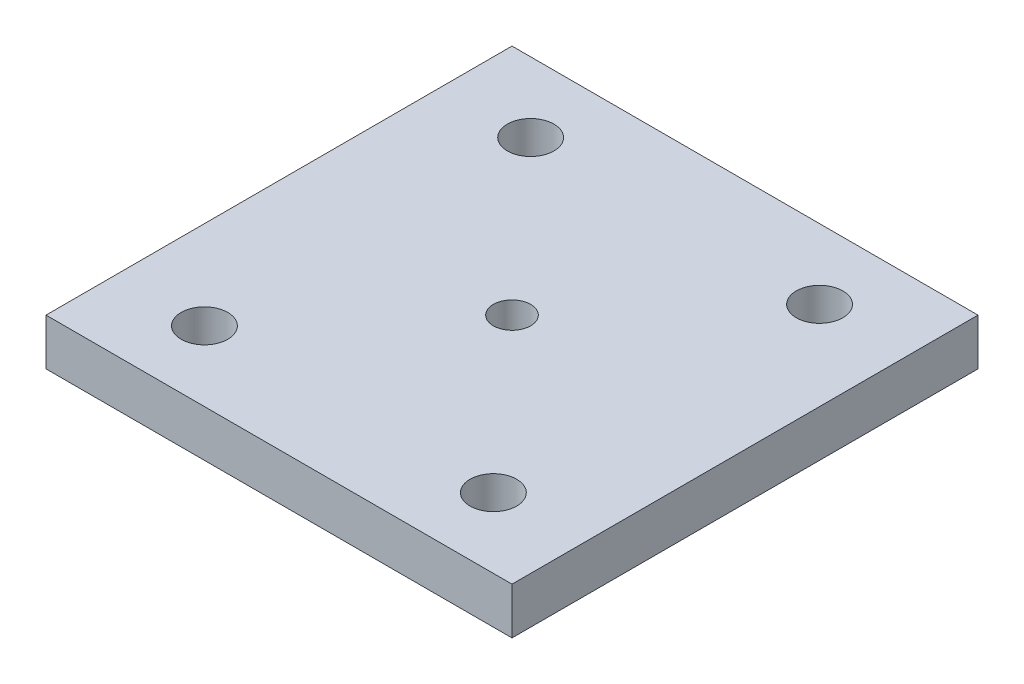
ISO-10303-21;
HEADER;
FILE_DESCRIPTION(('STEP AP214'),'2;1');
FILE_NAME('part.step','',(''),(''),'','','');
FILE_SCHEMA(('AUTOMOTIVE_DESIGN { 1 0 10303 214 1 1 1 1 }'));
ENDSEC;
DATA;
#1=APPLICATION_CONTEXT('core data for automotive mechanical design processes');
#2=APPLICATION_PROTOCOL_DEFINITION('international standard','automotive_design',2000,#1);
#3=PRODUCT_CONTEXT('',#1,'mechanical');
#4=PRODUCT('Part','Part','',(#3));
#5=PRODUCT_RELATED_PRODUCT_CATEGORY('part','',(#4));
#6=PRODUCT_DEFINITION_FORMATION('','',#4);
#7=PRODUCT_DEFINITION_CONTEXT('part definition',#1,'design');
#8=PRODUCT_DEFINITION('design','',#6,#7);
#9=PRODUCT_DEFINITION_SHAPE('','',#8);
#10=(LENGTH_UNIT() NAMED_UNIT(*) SI_UNIT(.MILLI.,.METRE.));
#11=(NAMED_UNIT(*) PLANE_ANGLE_UNIT() SI_UNIT($,.RADIAN.));
#12=(NAMED_UNIT(*) SI_UNIT($,.STERADIAN.) SOLID_ANGLE_UNIT());
#13=UNCERTAINTY_MEASURE_WITH_UNIT(LENGTH_MEASURE(1.E-05),#10,'distance_accuracy_value','');
#14=(GEOMETRIC_REPRESENTATION_CONTEXT(3) GLOBAL_UNCERTAINTY_ASSIGNED_CONTEXT((#13)) GLOBAL_UNIT_ASSIGNED_CONTEXT((#10,
#11,#12)) REPRESENTATION_CONTEXT('',''));
#15=CARTESIAN_POINT('',(0.,0.,0.));
#16=DIRECTION('',(0.,0.,1.));
#17=DIRECTION('',(1.,0.,0.));
#18=AXIS2_PLACEMENT_3D('',#15,#16,#17);
#19=CARTESIAN_POINT('',(0.,5.,0.));
#20=DIRECTION('',(1.,0.,0.));
#21=DIRECTION('',(0.,0.,-1.));
#22=AXIS2_PLACEMENT_3D('',#19,#20,#21);
#23=PLANE('',#22);
#24=DIRECTION('',(0.,0.,1.));
#25=VECTOR('',#24,1.);
#26=CARTESIAN_POINT('',(0.,0.,0.));
#27=LINE('',#26,#25);
#28=CARTESIAN_POINT('',(0.,0.,-50.));
#29=VERTEX_POINT('',#28);
#30=CARTESIAN_POINT('',(0.,0.,0.));
#31=VERTEX_POINT('',#30);
#32=EDGE_CURVE('E98',#29,#31,#27,.T.);
#33=ORIENTED_EDGE('',*,*,#32,.T.);
#34=DIRECTION('',(0.,-1.,0.));
#35=VECTOR('',#34,1.);
#36=CARTESIAN_POINT('',(0.,5.,0.));
#37=LINE('',#36,#35);
#38=CARTESIAN_POINT('',(0.,5.,0.));
#39=VERTEX_POINT('',#38);
#40=EDGE_CURVE('E11',#39,#31,#37,.T.);
#41=ORIENTED_EDGE('',*,*,#40,.F.);
#42=DIRECTION('',(0.,0.,1.));
#43=VECTOR('',#42,1.);
#44=CARTESIAN_POINT('',(0.,5.,0.));
#45=LINE('',#44,#43);
#46=CARTESIAN_POINT('',(0.,5.,-50.));
#47=VERTEX_POINT('',#46);
#48=EDGE_CURVE('E86',#47,#39,#45,.T.);
#49=ORIENTED_EDGE('',*,*,#48,.F.);
#50=DIRECTION('',(0.,-1.,0.));
#51=VECTOR('',#50,1.);
#52=CARTESIAN_POINT('',(0.,5.,-50.));
#53=LINE('',#52,#51);
#54=EDGE_CURVE('E94',#47,#29,#53,.T.);
#55=ORIENTED_EDGE('',*,*,#54,.T.);
#56=EDGE_LOOP('',(#33,#41,#49,#55));
#57=FACE_BOUND('',#56,.T.);
#58=ADVANCED_FACE('F35',(#57),#23,.F.);
#59=CARTESIAN_POINT('',(0.,5.,0.));
#60=DIRECTION('',(0.,0.,-1.));
#61=DIRECTION('',(-1.,0.,0.));
#62=AXIS2_PLACEMENT_3D('',#59,#60,#61);
#63=PLANE('',#62);
#64=DIRECTION('',(1.,0.,0.));
#65=VECTOR('',#64,1.);
#66=CARTESIAN_POINT('',(0.,0.,0.));
#67=LINE('',#66,#65);
#68=CARTESIAN_POINT('',(50.,0.,0.));
#69=VERTEX_POINT('',#68);
#70=EDGE_CURVE('E90',#31,#69,#67,.T.);
#71=ORIENTED_EDGE('',*,*,#70,.T.);
#72=DIRECTION('',(0.,-1.,0.));
#73=VECTOR('',#72,1.);
#74=CARTESIAN_POINT('',(50.,5.,0.));
#75=LINE('',#74,#73);
#76=CARTESIAN_POINT('',(50.,5.,0.));
#77=VERTEX_POINT('',#76);
#78=EDGE_CURVE('E43',#77,#69,#75,.T.);
#79=ORIENTED_EDGE('',*,*,#78,.F.);
#80=DIRECTION('',(1.,0.,0.));
#81=VECTOR('',#80,1.);
#82=CARTESIAN_POINT('',(0.,5.,0.));
#83=LINE('',#82,#81);
#84=EDGE_CURVE('E81',#39,#77,#83,.T.);
#85=ORIENTED_EDGE('',*,*,#84,.F.);
#86=ORIENTED_EDGE('',*,*,#40,.T.);
#87=EDGE_LOOP('',(#71,#79,#85,#86));
#88=FACE_BOUND('',#87,.T.);
#89=ADVANCED_FACE('F89',(#88),#63,.F.);
#90=CARTESIAN_POINT('',(50.,5.,0.));
#91=DIRECTION('',(-1.,0.,0.));
#92=DIRECTION('',(0.,0.,1.));
#93=AXIS2_PLACEMENT_3D('',#90,#91,#92);
#94=PLANE('',#93);
#95=DIRECTION('',(0.,0.,-1.));
#96=VECTOR('',#95,1.);
#97=CARTESIAN_POINT('',(50.,0.,0.));
#98=LINE('',#97,#96);
#99=CARTESIAN_POINT('',(50.,0.,-50.));
#100=VERTEX_POINT('',#99);
#101=EDGE_CURVE('E68',#69,#100,#98,.T.);
#102=ORIENTED_EDGE('',*,*,#101,.T.);
#103=DIRECTION('',(0.,-1.,0.));
#104=VECTOR('',#103,1.);
#105=CARTESIAN_POINT('',(50.,5.,-50.));
#106=LINE('',#105,#104);
#107=CARTESIAN_POINT('',(50.,5.,-50.));
#108=VERTEX_POINT('',#107);
#109=EDGE_CURVE('E91',#108,#100,#106,.T.);
#110=ORIENTED_EDGE('',*,*,#109,.F.);
#111=DIRECTION('',(0.,0.,-1.));
#112=VECTOR('',#111,1.);
#113=CARTESIAN_POINT('',(50.,5.,0.));
#114=LINE('',#113,#112);
#115=EDGE_CURVE('E84',#77,#108,#114,.T.);
#116=ORIENTED_EDGE('',*,*,#115,.F.);
#117=ORIENTED_EDGE('',*,*,#78,.T.);
#118=EDGE_LOOP('',(#102,#110,#116,#117));
#119=FACE_BOUND('',#118,.T.);
#120=ADVANCED_FACE('F92',(#119),#94,.F.);
#121=CARTESIAN_POINT('',(0.,5.,-50.));
#122=DIRECTION('',(0.,0.,1.));
#123=DIRECTION('',(1.,0.,0.));
#124=AXIS2_PLACEMENT_3D('',#121,#122,#123);
#125=PLANE('',#124);
#126=DIRECTION('',(-1.,0.,0.));
#127=VECTOR('',#126,1.);
#128=CARTESIAN_POINT('',(0.,0.,-50.));
#129=LINE('',#128,#127);
#130=EDGE_CURVE('E74',#100,#29,#129,.T.);
#131=ORIENTED_EDGE('',*,*,#130,.T.);
#132=ORIENTED_EDGE('',*,*,#54,.F.);
#133=DIRECTION('',(-1.,0.,0.));
#134=VECTOR('',#133,1.);
#135=CARTESIAN_POINT('',(0.,5.,-50.));
#136=LINE('',#135,#134);
#137=EDGE_CURVE('E51',#108,#47,#136,.T.);
#138=ORIENTED_EDGE('',*,*,#137,.F.);
#139=ORIENTED_EDGE('',*,*,#109,.T.);
#140=EDGE_LOOP('',(#131,#132,#138,#139));
#141=FACE_BOUND('',#140,.T.);
#142=ADVANCED_FACE('F106',(#141),#125,.F.);
#143=CARTESIAN_POINT('',(0.,5.,0.));
#144=DIRECTION('',(0.,-1.,0.));
#145=DIRECTION('',(0.,0.,-1.));
#146=AXIS2_PLACEMENT_3D('',#143,#144,#145);
#147=PLANE('',#146);
#148=CARTESIAN_POINT('',(9.5,5.,-42.5));
#149=DIRECTION('',(0.,-1.,0.));
#150=DIRECTION('',(0.,0.,-1.));
#151=AXIS2_PLACEMENT_3D('',#148,#149,#150);
#152=CIRCLE('',#151,2.5);
#153=CARTESIAN_POINT('',(9.5,5.,-45.));
#154=VERTEX_POINT('',#153);
#155=EDGE_CURVE('E123',#154,#154,#152,.T.);
#156=ORIENTED_EDGE('',*,*,#155,.T.);
#157=EDGE_LOOP('',(#156));
#158=FACE_BOUND('',#157,.T.);
#159=CARTESIAN_POINT('',(9.5,5.,-7.5));
#160=DIRECTION('',(0.,-1.,0.));
#161=DIRECTION('',(0.,0.,-1.));
#162=AXIS2_PLACEMENT_3D('',#159,#160,#161);
#163=CIRCLE('',#162,2.5);
#164=CARTESIAN_POINT('',(9.5,5.,-10.));
#165=VERTEX_POINT('',#164);
#166=EDGE_CURVE('E126',#165,#165,#163,.T.);
#167=ORIENTED_EDGE('',*,*,#166,.T.);
#168=EDGE_LOOP('',(#167));
#169=FACE_BOUND('',#168,.T.);
#170=CARTESIAN_POINT('',(40.5,5.,-7.5));
#171=DIRECTION('',(0.,-1.,0.));
#172=DIRECTION('',(0.,0.,-1.));
#173=AXIS2_PLACEMENT_3D('',#170,#171,#172);
#174=CIRCLE('',#173,2.5);
#175=CARTESIAN_POINT('',(40.5,5.,-10.));
#176=VERTEX_POINT('',#175);
#177=EDGE_CURVE('E129',#176,#176,#174,.T.);
#178=ORIENTED_EDGE('',*,*,#177,.T.);
#179=EDGE_LOOP('',(#178));
#180=FACE_BOUND('',#179,.T.);
#181=CARTESIAN_POINT('',(40.5,5.,-42.5));
#182=DIRECTION('',(0.,-1.,0.));
#183=DIRECTION('',(0.,0.,-1.));
#184=AXIS2_PLACEMENT_3D('',#181,#182,#183);
#185=CIRCLE('',#184,2.5);
#186=CARTESIAN_POINT('',(40.5,5.,-45.));
#187=VERTEX_POINT('',#186);
#188=EDGE_CURVE('E115',#187,#187,#185,.T.);
#189=ORIENTED_EDGE('',*,*,#188,.T.);
#190=EDGE_LOOP('',(#189));
#191=FACE_BOUND('',#190,.T.);
#192=CARTESIAN_POINT('',(25.,5.,-25.));
#193=DIRECTION('',(0.,1.,0.));
#194=DIRECTION('',(0.,0.,1.));
#195=AXIS2_PLACEMENT_3D('',#192,#193,#194);
#196=CIRCLE('',#195,2.);
#197=CARTESIAN_POINT('',(25.,5.,-23.));
#198=VERTEX_POINT('',#197);
#199=EDGE_CURVE('E112',#198,#198,#196,.T.);
#200=ORIENTED_EDGE('',*,*,#199,.F.);
#201=EDGE_LOOP('',(#200));
#202=FACE_BOUND('',#201,.T.);
#203=ORIENTED_EDGE('',*,*,#48,.T.);
#204=ORIENTED_EDGE('',*,*,#84,.T.);
#205=ORIENTED_EDGE('',*,*,#115,.T.);
#206=ORIENTED_EDGE('',*,*,#137,.T.);
#207=EDGE_LOOP('',(#203,#204,#205,#206));
#208=FACE_BOUND('',#207,.T.);
#209=ADVANCED_FACE('F82',(#158,#169,#180,#191,#202,#208),#147,.F.);
#210=CARTESIAN_POINT('',(0.,0.,0.));
#211=DIRECTION('',(0.,-1.,0.));
#212=DIRECTION('',(0.,0.,-1.));
#213=AXIS2_PLACEMENT_3D('',#210,#211,#212);
#214=PLANE('',#213);
#215=CARTESIAN_POINT('',(9.5,0.,-42.5));
#216=DIRECTION('',(0.,-1.,0.));
#217=DIRECTION('',(0.,0.,-1.));
#218=AXIS2_PLACEMENT_3D('',#215,#216,#217);
#219=CIRCLE('',#218,2.5);
#220=CARTESIAN_POINT('',(9.5,0.,-45.));
#221=VERTEX_POINT('',#220);
#222=EDGE_CURVE('E132',#221,#221,#219,.T.);
#223=ORIENTED_EDGE('',*,*,#222,.F.);
#224=EDGE_LOOP('',(#223));
#225=FACE_BOUND('',#224,.T.);
#226=CARTESIAN_POINT('',(9.5,0.,-7.5));
#227=DIRECTION('',(0.,-1.,0.));
#228=DIRECTION('',(0.,0.,-1.));
#229=AXIS2_PLACEMENT_3D('',#226,#227,#228);
#230=CIRCLE('',#229,2.5);
#231=CARTESIAN_POINT('',(9.5,0.,-10.));
#232=VERTEX_POINT('',#231);
#233=EDGE_CURVE('E136',#232,#232,#230,.T.);
#234=ORIENTED_EDGE('',*,*,#233,.F.);
#235=EDGE_LOOP('',(#234));
#236=FACE_BOUND('',#235,.T.);
#237=CARTESIAN_POINT('',(40.5,0.,-7.5));
#238=DIRECTION('',(0.,-1.,0.));
#239=DIRECTION('',(0.,0.,-1.));
#240=AXIS2_PLACEMENT_3D('',#237,#238,#239);
#241=CIRCLE('',#240,2.5);
#242=CARTESIAN_POINT('',(40.5,0.,-10.));
#243=VERTEX_POINT('',#242);
#244=EDGE_CURVE('E133',#243,#243,#241,.T.);
#245=ORIENTED_EDGE('',*,*,#244,.F.);
#246=EDGE_LOOP('',(#245));
#247=FACE_BOUND('',#246,.T.);
#248=CARTESIAN_POINT('',(40.5,0.,-42.5));
#249=DIRECTION('',(0.,-1.,0.));
#250=DIRECTION('',(0.,0.,-1.));
#251=AXIS2_PLACEMENT_3D('',#248,#249,#250);
#252=CIRCLE('',#251,2.5);
#253=CARTESIAN_POINT('',(40.5,0.,-45.));
#254=VERTEX_POINT('',#253);
#255=EDGE_CURVE('E120',#254,#254,#252,.T.);
#256=ORIENTED_EDGE('',*,*,#255,.F.);
#257=EDGE_LOOP('',(#256));
#258=FACE_BOUND('',#257,.T.);
#259=CARTESIAN_POINT('',(25.,0.,-25.));
#260=DIRECTION('',(0.,1.,0.));
#261=DIRECTION('',(0.,0.,1.));
#262=AXIS2_PLACEMENT_3D('',#259,#260,#261);
#263=CIRCLE('',#262,2.);
#264=CARTESIAN_POINT('',(25.,0.,-23.));
#265=VERTEX_POINT('',#264);
#266=EDGE_CURVE('E101',#265,#265,#263,.T.);
#267=ORIENTED_EDGE('',*,*,#266,.T.);
#268=EDGE_LOOP('',(#267));
#269=FACE_BOUND('',#268,.T.);
#270=ORIENTED_EDGE('',*,*,#32,.F.);
#271=ORIENTED_EDGE('',*,*,#130,.F.);
#272=ORIENTED_EDGE('',*,*,#101,.F.);
#273=ORIENTED_EDGE('',*,*,#70,.F.);
#274=EDGE_LOOP('',(#270,#271,#272,#273));
#275=FACE_BOUND('',#274,.T.);
#276=ADVANCED_FACE('F109',(#225,#236,#247,#258,#269,#275),#214,.T.);
#277=CARTESIAN_POINT('',(25.,0.,-25.));
#278=DIRECTION('',(0.,1.,0.));
#279=DIRECTION('',(0.,0.,1.));
#280=AXIS2_PLACEMENT_3D('',#277,#278,#279);
#281=CYLINDRICAL_SURFACE('',#280,2.);
#282=ORIENTED_EDGE('',*,*,#266,.F.);
#283=EDGE_LOOP('',(#282));
#284=FACE_BOUND('',#283,.T.);
#285=ORIENTED_EDGE('',*,*,#199,.T.);
#286=EDGE_LOOP('',(#285));
#287=FACE_BOUND('',#286,.T.);
#288=ADVANCED_FACE('F147',(#284,#287),#281,.F.);
#289=CARTESIAN_POINT('',(40.5,10.,-42.5));
#290=DIRECTION('',(0.,-1.,0.));
#291=DIRECTION('',(0.,0.,-1.));
#292=AXIS2_PLACEMENT_3D('',#289,#290,#291);
#293=CYLINDRICAL_SURFACE('',#292,2.5);
#294=ORIENTED_EDGE('',*,*,#255,.T.);
#295=EDGE_LOOP('',(#294));
#296=FACE_BOUND('',#295,.T.);
#297=ORIENTED_EDGE('',*,*,#188,.F.);
#298=EDGE_LOOP('',(#297));
#299=FACE_BOUND('',#298,.T.);
#300=ADVANCED_FACE('F159',(#296,#299),#293,.F.);
#301=CARTESIAN_POINT('',(40.5,10.,-7.5));
#302=DIRECTION('',(0.,-1.,0.));
#303=DIRECTION('',(0.,0.,-1.));
#304=AXIS2_PLACEMENT_3D('',#301,#302,#303);
#305=CYLINDRICAL_SURFACE('',#304,2.5);
#306=ORIENTED_EDGE('',*,*,#244,.T.);
#307=EDGE_LOOP('',(#306));
#308=FACE_BOUND('',#307,.T.);
#309=ORIENTED_EDGE('',*,*,#177,.F.);
#310=EDGE_LOOP('',(#309));
#311=FACE_BOUND('',#310,.T.);
#312=ADVANCED_FACE('F205',(#308,#311),#305,.F.);
#313=CARTESIAN_POINT('',(9.5,10.,-7.5));
#314=DIRECTION('',(0.,-1.,0.));
#315=DIRECTION('',(0.,0.,-1.));
#316=AXIS2_PLACEMENT_3D('',#313,#314,#315);
#317=CYLINDRICAL_SURFACE('',#316,2.5);
#318=ORIENTED_EDGE('',*,*,#233,.T.);
#319=EDGE_LOOP('',(#318));
#320=FACE_BOUND('',#319,.T.);
#321=ORIENTED_EDGE('',*,*,#166,.F.);
#322=EDGE_LOOP('',(#321));
#323=FACE_BOUND('',#322,.T.);
#324=ADVANCED_FACE('F213',(#320,#323),#317,.F.);
#325=CARTESIAN_POINT('',(9.5,10.,-42.5));
#326=DIRECTION('',(0.,-1.,0.));
#327=DIRECTION('',(0.,0.,-1.));
#328=AXIS2_PLACEMENT_3D('',#325,#326,#327);
#329=CYLINDRICAL_SURFACE('',#328,2.5);
#330=ORIENTED_EDGE('',*,*,#222,.T.);
#331=EDGE_LOOP('',(#330));
#332=FACE_BOUND('',#331,.T.);
#333=ORIENTED_EDGE('',*,*,#155,.F.);
#334=EDGE_LOOP('',(#333));
#335=FACE_BOUND('',#334,.T.);
#336=ADVANCED_FACE('F142',(#332,#335),#329,.F.);
#337=CLOSED_SHELL('',(#58,#89,#120,#142,#209,#276,#288,#300,#312,#324,#336));
#338=MANIFOLD_SOLID_BREP('B2',#337);
#339=ADVANCED_BREP_SHAPE_REPRESENTATION('',(#18,#338),#14);
#340=SHAPE_DEFINITION_REPRESENTATION(#9,#339);
ENDSEC;
END-ISO-10303-21;
